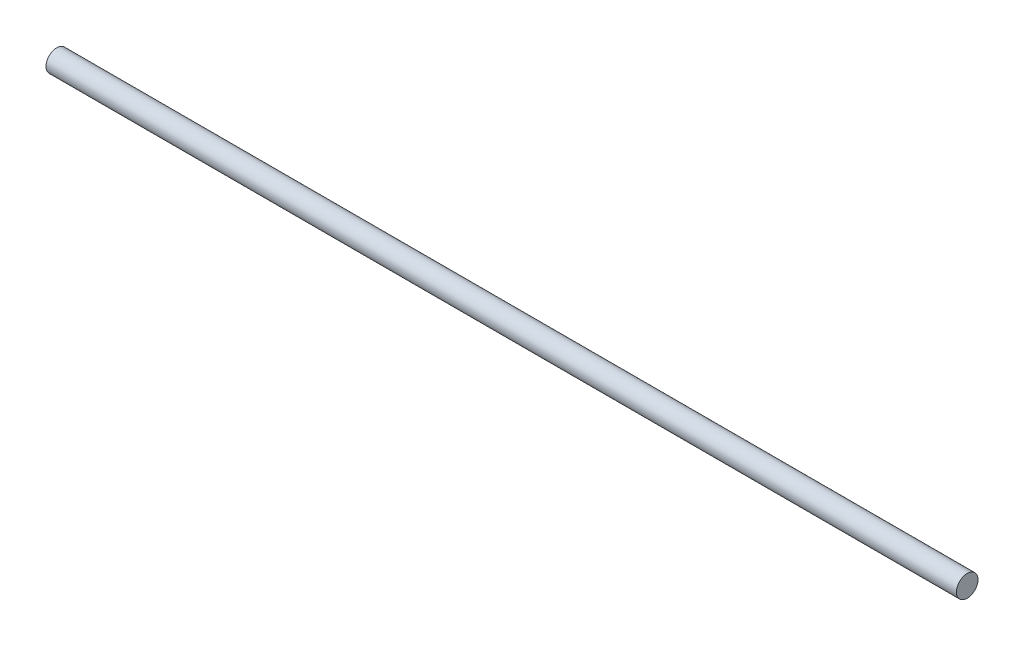
ISO-10303-21;
HEADER;
FILE_DESCRIPTION(('STEP AP214'),'2;1');
FILE_NAME('part.step','',(''),(''),'','','');
FILE_SCHEMA(('AUTOMOTIVE_DESIGN { 1 0 10303 214 1 1 1 1 }'));
ENDSEC;
DATA;
#1=APPLICATION_CONTEXT('core data for automotive mechanical design processes');
#2=APPLICATION_PROTOCOL_DEFINITION('international standard','automotive_design',2000,#1);
#3=PRODUCT_CONTEXT('',#1,'mechanical');
#4=PRODUCT('Part','Part','',(#3));
#5=PRODUCT_RELATED_PRODUCT_CATEGORY('part','',(#4));
#6=PRODUCT_DEFINITION_FORMATION('','',#4);
#7=PRODUCT_DEFINITION_CONTEXT('part definition',#1,'design');
#8=PRODUCT_DEFINITION('design','',#6,#7);
#9=PRODUCT_DEFINITION_SHAPE('','',#8);
#10=(LENGTH_UNIT() NAMED_UNIT(*) SI_UNIT(.MILLI.,.METRE.));
#11=(NAMED_UNIT(*) PLANE_ANGLE_UNIT() SI_UNIT($,.RADIAN.));
#12=(NAMED_UNIT(*) SI_UNIT($,.STERADIAN.) SOLID_ANGLE_UNIT());
#13=UNCERTAINTY_MEASURE_WITH_UNIT(LENGTH_MEASURE(1.E-05),#10,'distance_accuracy_value','');
#14=(GEOMETRIC_REPRESENTATION_CONTEXT(3) GLOBAL_UNCERTAINTY_ASSIGNED_CONTEXT((#13)) GLOBAL_UNIT_ASSIGNED_CONTEXT((#10,
#11,#12)) REPRESENTATION_CONTEXT('',''));
#15=CARTESIAN_POINT('',(0.,0.,0.));
#16=DIRECTION('',(0.,0.,1.));
#17=DIRECTION('',(1.,0.,0.));
#18=AXIS2_PLACEMENT_3D('',#15,#16,#17);
#19=CARTESIAN_POINT('',(-527.5,0.,0.));
#20=DIRECTION('',(1.,0.,0.));
#21=DIRECTION('',(0.,0.,-1.));
#22=AXIS2_PLACEMENT_3D('',#19,#20,#21);
#23=CYLINDRICAL_SURFACE('',#22,12.5);
#24=CARTESIAN_POINT('',(-527.5,0.,0.));
#25=DIRECTION('',(1.,0.,0.));
#26=DIRECTION('',(0.,0.,-1.));
#27=AXIS2_PLACEMENT_3D('',#24,#25,#26);
#28=CIRCLE('',#27,12.5);
#29=CARTESIAN_POINT('',(-527.5,0.,-12.5));
#30=VERTEX_POINT('',#29);
#31=EDGE_CURVE('E10',#30,#30,#28,.T.);
#32=ORIENTED_EDGE('',*,*,#31,.T.);
#33=EDGE_LOOP('',(#32));
#34=FACE_BOUND('',#33,.T.);
#35=CARTESIAN_POINT('',(527.5,0.,0.));
#36=DIRECTION('',(1.,0.,0.));
#37=DIRECTION('',(0.,0.,-1.));
#38=AXIS2_PLACEMENT_3D('',#35,#36,#37);
#39=CIRCLE('',#38,12.5);
#40=CARTESIAN_POINT('',(527.5,0.,-12.5));
#41=VERTEX_POINT('',#40);
#42=EDGE_CURVE('E36',#41,#41,#39,.T.);
#43=ORIENTED_EDGE('',*,*,#42,.F.);
#44=EDGE_LOOP('',(#43));
#45=FACE_BOUND('',#44,.T.);
#46=ADVANCED_FACE('F30',(#34,#45),#23,.T.);
#47=CARTESIAN_POINT('',(-527.5,0.,0.));
#48=DIRECTION('',(1.,0.,0.));
#49=DIRECTION('',(0.,0.,-1.));
#50=AXIS2_PLACEMENT_3D('',#47,#48,#49);
#51=PLANE('',#50);
#52=ORIENTED_EDGE('',*,*,#31,.F.);
#53=EDGE_LOOP('',(#52));
#54=FACE_BOUND('',#53,.T.);
#55=ADVANCED_FACE('F45',(#54),#51,.F.);
#56=CARTESIAN_POINT('',(527.5,0.,0.));
#57=DIRECTION('',(1.,0.,0.));
#58=DIRECTION('',(0.,0.,-1.));
#59=AXIS2_PLACEMENT_3D('',#56,#57,#58);
#60=PLANE('',#59);
#61=ORIENTED_EDGE('',*,*,#42,.T.);
#62=EDGE_LOOP('',(#61));
#63=FACE_BOUND('',#62,.T.);
#64=ADVANCED_FACE('F42',(#63),#60,.T.);
#65=CLOSED_SHELL('',(#46,#55,#64));
#66=MANIFOLD_SOLID_BREP('B2',#65);
#67=ADVANCED_BREP_SHAPE_REPRESENTATION('',(#18,#66),#14);
#68=SHAPE_DEFINITION_REPRESENTATION(#9,#67);
ENDSEC;
END-ISO-10303-21;
